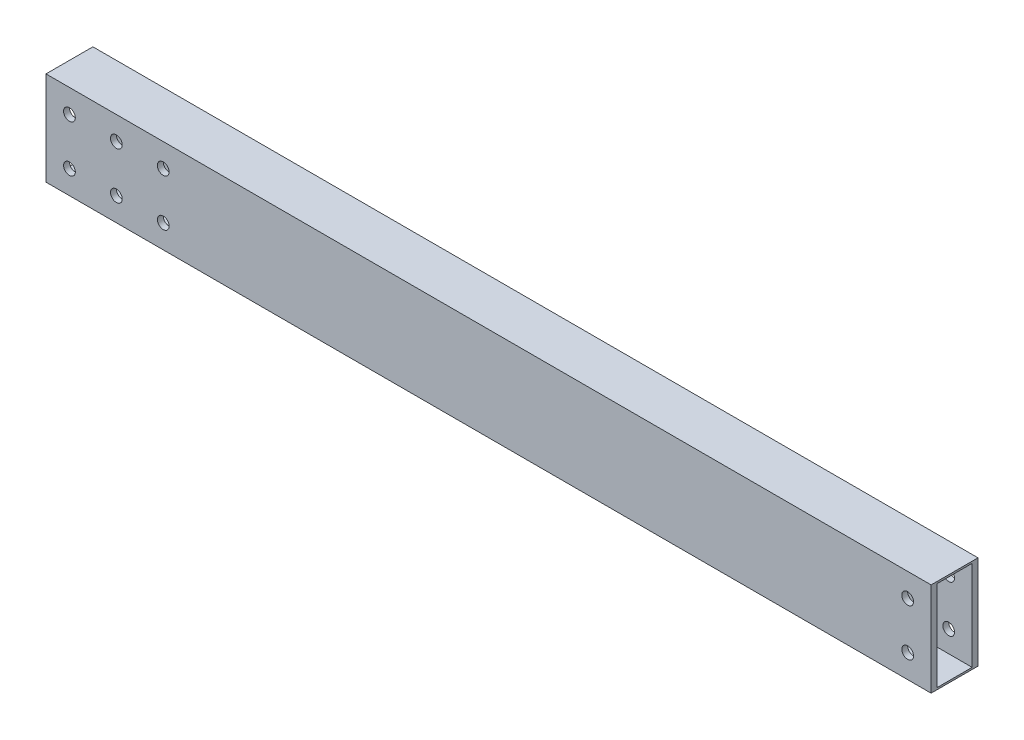
ISO-10303-21;
HEADER;
FILE_DESCRIPTION(('STEP AP214'),'2;1');
FILE_NAME('part.step','',(''),(''),'','','');
FILE_SCHEMA(('AUTOMOTIVE_DESIGN { 1 0 10303 214 1 1 1 1 }'));
ENDSEC;
DATA;
#1=APPLICATION_CONTEXT('core data for automotive mechanical design processes');
#2=APPLICATION_PROTOCOL_DEFINITION('international standard','automotive_design',2000,#1);
#3=PRODUCT_CONTEXT('',#1,'mechanical');
#4=PRODUCT('Part','Part','',(#3));
#5=PRODUCT_RELATED_PRODUCT_CATEGORY('part','',(#4));
#6=PRODUCT_DEFINITION_FORMATION('','',#4);
#7=PRODUCT_DEFINITION_CONTEXT('part definition',#1,'design');
#8=PRODUCT_DEFINITION('design','',#6,#7);
#9=PRODUCT_DEFINITION_SHAPE('','',#8);
#10=(LENGTH_UNIT() NAMED_UNIT(*) SI_UNIT(.MILLI.,.METRE.));
#11=(NAMED_UNIT(*) PLANE_ANGLE_UNIT() SI_UNIT($,.RADIAN.));
#12=(NAMED_UNIT(*) SI_UNIT($,.STERADIAN.) SOLID_ANGLE_UNIT());
#13=UNCERTAINTY_MEASURE_WITH_UNIT(LENGTH_MEASURE(1.E-05),#10,'distance_accuracy_value','');
#14=(GEOMETRIC_REPRESENTATION_CONTEXT(3) GLOBAL_UNCERTAINTY_ASSIGNED_CONTEXT((#13)) GLOBAL_UNIT_ASSIGNED_CONTEXT((#10,
#11,#12)) REPRESENTATION_CONTEXT('',''));
#15=CARTESIAN_POINT('',(0.,0.,0.));
#16=DIRECTION('',(0.,0.,1.));
#17=DIRECTION('',(1.,0.,0.));
#18=AXIS2_PLACEMENT_3D('',#15,#16,#17);
#19=CARTESIAN_POINT('',(479.336862,0.,0.));
#20=DIRECTION('',(0.,0.,-1.));
#21=DIRECTION('',(-1.,0.,0.));
#22=AXIS2_PLACEMENT_3D('',#19,#20,#21);
#23=PLANE('',#22);
#24=CARTESIAN_POINT('',(38.1,12.7,0.));
#25=DIRECTION('',(0.,0.,-1.));
#26=DIRECTION('',(-1.,0.,0.));
#27=AXIS2_PLACEMENT_3D('',#24,#25,#26);
#28=CIRCLE('',#27,3.175);
#29=CARTESIAN_POINT('',(34.925,12.7,0.));
#30=VERTEX_POINT('',#29);
#31=EDGE_CURVE('E146',#30,#30,#28,.T.);
#32=ORIENTED_EDGE('',*,*,#31,.T.);
#33=EDGE_LOOP('',(#32));
#34=FACE_BOUND('',#33,.T.);
#35=CARTESIAN_POINT('',(12.7,12.7,0.));
#36=DIRECTION('',(0.,0.,-1.));
#37=DIRECTION('',(-1.,0.,0.));
#38=AXIS2_PLACEMENT_3D('',#35,#36,#37);
#39=CIRCLE('',#38,3.175);
#40=CARTESIAN_POINT('',(9.525,12.7,0.));
#41=VERTEX_POINT('',#40);
#42=EDGE_CURVE('E251',#41,#41,#39,.T.);
#43=ORIENTED_EDGE('',*,*,#42,.T.);
#44=EDGE_LOOP('',(#43));
#45=FACE_BOUND('',#44,.T.);
#46=CARTESIAN_POINT('',(466.636862,12.7,0.));
#47=DIRECTION('',(0.,0.,-1.));
#48=DIRECTION('',(-1.,0.,0.));
#49=AXIS2_PLACEMENT_3D('',#46,#47,#48);
#50=CIRCLE('',#49,3.17499999999997);
#51=CARTESIAN_POINT('',(463.461862,12.7,0.));
#52=VERTEX_POINT('',#51);
#53=EDGE_CURVE('E245',#52,#52,#50,.T.);
#54=ORIENTED_EDGE('',*,*,#53,.T.);
#55=EDGE_LOOP('',(#54));
#56=FACE_BOUND('',#55,.T.);
#57=CARTESIAN_POINT('',(38.1,38.1,0.));
#58=DIRECTION('',(0.,0.,-1.));
#59=DIRECTION('',(-1.,0.,0.));
#60=AXIS2_PLACEMENT_3D('',#57,#58,#59);
#61=CIRCLE('',#60,3.175);
#62=CARTESIAN_POINT('',(34.925,38.1,0.));
#63=VERTEX_POINT('',#62);
#64=EDGE_CURVE('E240',#63,#63,#61,.T.);
#65=ORIENTED_EDGE('',*,*,#64,.T.);
#66=EDGE_LOOP('',(#65));
#67=FACE_BOUND('',#66,.T.);
#68=CARTESIAN_POINT('',(63.5,38.1,0.));
#69=DIRECTION('',(0.,0.,-1.));
#70=DIRECTION('',(-1.,0.,0.));
#71=AXIS2_PLACEMENT_3D('',#68,#69,#70);
#72=CIRCLE('',#71,3.175);
#73=CARTESIAN_POINT('',(60.325,38.1,0.));
#74=VERTEX_POINT('',#73);
#75=EDGE_CURVE('E235',#74,#74,#72,.T.);
#76=ORIENTED_EDGE('',*,*,#75,.T.);
#77=EDGE_LOOP('',(#76));
#78=FACE_BOUND('',#77,.T.);
#79=CARTESIAN_POINT('',(63.5,12.7,0.));
#80=DIRECTION('',(0.,0.,-1.));
#81=DIRECTION('',(-1.,0.,0.));
#82=AXIS2_PLACEMENT_3D('',#79,#80,#81);
#83=CIRCLE('',#82,3.175);
#84=CARTESIAN_POINT('',(60.325,12.7,0.));
#85=VERTEX_POINT('',#84);
#86=EDGE_CURVE('E229',#85,#85,#83,.T.);
#87=ORIENTED_EDGE('',*,*,#86,.T.);
#88=EDGE_LOOP('',(#87));
#89=FACE_BOUND('',#88,.T.);
#90=CARTESIAN_POINT('',(466.636862,38.1,0.));
#91=DIRECTION('',(0.,0.,-1.));
#92=DIRECTION('',(-1.,0.,0.));
#93=AXIS2_PLACEMENT_3D('',#90,#91,#92);
#94=CIRCLE('',#93,3.17499999999997);
#95=CARTESIAN_POINT('',(463.461862,38.1,0.));
#96=VERTEX_POINT('',#95);
#97=EDGE_CURVE('E223',#96,#96,#94,.T.);
#98=ORIENTED_EDGE('',*,*,#97,.T.);
#99=EDGE_LOOP('',(#98));
#100=FACE_BOUND('',#99,.T.);
#101=CARTESIAN_POINT('',(12.7,38.1,0.));
#102=DIRECTION('',(0.,0.,-1.));
#103=DIRECTION('',(-1.,0.,0.));
#104=AXIS2_PLACEMENT_3D('',#101,#102,#103);
#105=CIRCLE('',#104,3.175);
#106=CARTESIAN_POINT('',(9.525,38.1,0.));
#107=VERTEX_POINT('',#106);
#108=EDGE_CURVE('E217',#107,#107,#105,.T.);
#109=ORIENTED_EDGE('',*,*,#108,.T.);
#110=EDGE_LOOP('',(#109));
#111=FACE_BOUND('',#110,.T.);
#112=DIRECTION('',(0.,-1.,0.));
#113=VECTOR('',#112,1.);
#114=CARTESIAN_POINT('',(0.,0.,0.));
#115=LINE('',#114,#113);
#116=CARTESIAN_POINT('',(0.,50.8,0.));
#117=VERTEX_POINT('',#116);
#118=CARTESIAN_POINT('',(0.,0.,0.));
#119=VERTEX_POINT('',#118);
#120=EDGE_CURVE('E164',#117,#119,#115,.T.);
#121=ORIENTED_EDGE('',*,*,#120,.T.);
#122=DIRECTION('',(-1.,0.,0.));
#123=VECTOR('',#122,1.);
#124=CARTESIAN_POINT('',(479.336862,0.,0.));
#125=LINE('',#124,#123);
#126=CARTESIAN_POINT('',(479.336862,0.,0.));
#127=VERTEX_POINT('',#126);
#128=EDGE_CURVE('E11',#127,#119,#125,.T.);
#129=ORIENTED_EDGE('',*,*,#128,.F.);
#130=DIRECTION('',(0.,-1.,0.));
#131=VECTOR('',#130,1.);
#132=CARTESIAN_POINT('',(479.336862,0.,0.));
#133=LINE('',#132,#131);
#134=CARTESIAN_POINT('',(479.336862,50.8,0.));
#135=VERTEX_POINT('',#134);
#136=EDGE_CURVE('E170',#135,#127,#133,.T.);
#137=ORIENTED_EDGE('',*,*,#136,.F.);
#138=DIRECTION('',(-1.,0.,0.));
#139=VECTOR('',#138,1.);
#140=CARTESIAN_POINT('',(479.336862,50.8,0.));
#141=LINE('',#140,#139);
#142=EDGE_CURVE('E184',#135,#117,#141,.T.);
#143=ORIENTED_EDGE('',*,*,#142,.T.);
#144=EDGE_LOOP('',(#121,#129,#137,#143));
#145=FACE_BOUND('',#144,.T.);
#146=ADVANCED_FACE('F51',(#34,#45,#56,#67,#78,#89,#100,#111,#145),#23,.F.);
#147=CARTESIAN_POINT('',(479.336862,0.,0.));
#148=DIRECTION('',(0.,1.,0.));
#149=DIRECTION('',(0.,0.,1.));
#150=AXIS2_PLACEMENT_3D('',#147,#148,#149);
#151=PLANE('',#150);
#152=DIRECTION('',(0.,0.,-1.));
#153=VECTOR('',#152,1.);
#154=CARTESIAN_POINT('',(0.,0.,0.));
#155=LINE('',#154,#153);
#156=CARTESIAN_POINT('',(0.,0.,-25.4));
#157=VERTEX_POINT('',#156);
#158=EDGE_CURVE('E188',#119,#157,#155,.T.);
#159=ORIENTED_EDGE('',*,*,#158,.T.);
#160=DIRECTION('',(-1.,0.,0.));
#161=VECTOR('',#160,1.);
#162=CARTESIAN_POINT('',(479.336862,0.,-25.4));
#163=LINE('',#162,#161);
#164=CARTESIAN_POINT('',(479.336862,0.,-25.4));
#165=VERTEX_POINT('',#164);
#166=EDGE_CURVE('E60',#165,#157,#163,.T.);
#167=ORIENTED_EDGE('',*,*,#166,.F.);
#168=DIRECTION('',(0.,0.,-1.));
#169=VECTOR('',#168,1.);
#170=CARTESIAN_POINT('',(479.336862,0.,0.));
#171=LINE('',#170,#169);
#172=EDGE_CURVE('E174',#127,#165,#171,.T.);
#173=ORIENTED_EDGE('',*,*,#172,.F.);
#174=ORIENTED_EDGE('',*,*,#128,.T.);
#175=EDGE_LOOP('',(#159,#167,#173,#174));
#176=FACE_BOUND('',#175,.T.);
#177=ADVANCED_FACE('F301',(#176),#151,.F.);
#178=CARTESIAN_POINT('',(479.336862,0.,-25.4));
#179=DIRECTION('',(0.,0.,1.));
#180=DIRECTION('',(1.,0.,0.));
#181=AXIS2_PLACEMENT_3D('',#178,#179,#180);
#182=PLANE('',#181);
#183=CARTESIAN_POINT('',(38.1,12.7,-25.4));
#184=DIRECTION('',(0.,0.,1.));
#185=DIRECTION('',(1.,0.,0.));
#186=AXIS2_PLACEMENT_3D('',#183,#184,#185);
#187=CIRCLE('',#186,3.175);
#188=CARTESIAN_POINT('',(41.275,12.7,-25.4));
#189=VERTEX_POINT('',#188);
#190=EDGE_CURVE('E634',#189,#189,#187,.T.);
#191=ORIENTED_EDGE('',*,*,#190,.T.);
#192=EDGE_LOOP('',(#191));
#193=FACE_BOUND('',#192,.T.);
#194=CARTESIAN_POINT('',(12.7,12.7,-25.4));
#195=DIRECTION('',(0.,0.,1.));
#196=DIRECTION('',(1.,0.,0.));
#197=AXIS2_PLACEMENT_3D('',#194,#195,#196);
#198=CIRCLE('',#197,3.175);
#199=CARTESIAN_POINT('',(15.875,12.7,-25.4));
#200=VERTEX_POINT('',#199);
#201=EDGE_CURVE('E639',#200,#200,#198,.T.);
#202=ORIENTED_EDGE('',*,*,#201,.T.);
#203=EDGE_LOOP('',(#202));
#204=FACE_BOUND('',#203,.T.);
#205=CARTESIAN_POINT('',(466.636862,12.7,-25.4));
#206=DIRECTION('',(0.,0.,1.));
#207=DIRECTION('',(1.,0.,0.));
#208=AXIS2_PLACEMENT_3D('',#205,#206,#207);
#209=CIRCLE('',#208,3.17499999999997);
#210=CARTESIAN_POINT('',(469.811862,12.7,-25.4));
#211=VERTEX_POINT('',#210);
#212=EDGE_CURVE('E425',#211,#211,#209,.T.);
#213=ORIENTED_EDGE('',*,*,#212,.T.);
#214=EDGE_LOOP('',(#213));
#215=FACE_BOUND('',#214,.T.);
#216=CARTESIAN_POINT('',(38.1,38.1,-25.4));
#217=DIRECTION('',(0.,0.,1.));
#218=DIRECTION('',(1.,0.,0.));
#219=AXIS2_PLACEMENT_3D('',#216,#217,#218);
#220=CIRCLE('',#219,3.175);
#221=CARTESIAN_POINT('',(41.275,38.1,-25.4));
#222=VERTEX_POINT('',#221);
#223=EDGE_CURVE('E397',#222,#222,#220,.T.);
#224=ORIENTED_EDGE('',*,*,#223,.T.);
#225=EDGE_LOOP('',(#224));
#226=FACE_BOUND('',#225,.T.);
#227=CARTESIAN_POINT('',(63.5,38.1,-25.4));
#228=DIRECTION('',(0.,0.,1.));
#229=DIRECTION('',(1.,0.,0.));
#230=AXIS2_PLACEMENT_3D('',#227,#228,#229);
#231=CIRCLE('',#230,3.175);
#232=CARTESIAN_POINT('',(66.675,38.1,-25.4));
#233=VERTEX_POINT('',#232);
#234=EDGE_CURVE('E628',#233,#233,#231,.T.);
#235=ORIENTED_EDGE('',*,*,#234,.T.);
#236=EDGE_LOOP('',(#235));
#237=FACE_BOUND('',#236,.T.);
#238=CARTESIAN_POINT('',(63.5,12.7,-25.4));
#239=DIRECTION('',(0.,0.,1.));
#240=DIRECTION('',(1.,0.,0.));
#241=AXIS2_PLACEMENT_3D('',#238,#239,#240);
#242=CIRCLE('',#241,3.175);
#243=CARTESIAN_POINT('',(66.675,12.7,-25.4));
#244=VERTEX_POINT('',#243);
#245=EDGE_CURVE('E625',#244,#244,#242,.T.);
#246=ORIENTED_EDGE('',*,*,#245,.T.);
#247=EDGE_LOOP('',(#246));
#248=FACE_BOUND('',#247,.T.);
#249=CARTESIAN_POINT('',(466.636862,38.1,-25.4));
#250=DIRECTION('',(0.,0.,1.));
#251=DIRECTION('',(1.,0.,0.));
#252=AXIS2_PLACEMENT_3D('',#249,#250,#251);
#253=CIRCLE('',#252,3.17499999999997);
#254=CARTESIAN_POINT('',(469.811862,38.1,-25.4));
#255=VERTEX_POINT('',#254);
#256=EDGE_CURVE('E629',#255,#255,#253,.T.);
#257=ORIENTED_EDGE('',*,*,#256,.T.);
#258=EDGE_LOOP('',(#257));
#259=FACE_BOUND('',#258,.T.);
#260=CARTESIAN_POINT('',(12.7,38.1,-25.4));
#261=DIRECTION('',(0.,0.,1.));
#262=DIRECTION('',(1.,0.,0.));
#263=AXIS2_PLACEMENT_3D('',#260,#261,#262);
#264=CIRCLE('',#263,3.175);
#265=CARTESIAN_POINT('',(15.875,38.1,-25.4));
#266=VERTEX_POINT('',#265);
#267=EDGE_CURVE('E211',#266,#266,#264,.T.);
#268=ORIENTED_EDGE('',*,*,#267,.T.);
#269=EDGE_LOOP('',(#268));
#270=FACE_BOUND('',#269,.T.);
#271=DIRECTION('',(0.,1.,0.));
#272=VECTOR('',#271,1.);
#273=CARTESIAN_POINT('',(0.,0.,-25.4));
#274=LINE('',#273,#272);
#275=CARTESIAN_POINT('',(0.,50.8,-25.4));
#276=VERTEX_POINT('',#275);
#277=EDGE_CURVE('E191',#157,#276,#274,.T.);
#278=ORIENTED_EDGE('',*,*,#277,.T.);
#279=DIRECTION('',(-1.,0.,0.));
#280=VECTOR('',#279,1.);
#281=CARTESIAN_POINT('',(479.336862,50.8,-25.4));
#282=LINE('',#281,#280);
#283=CARTESIAN_POINT('',(479.336862,50.8,-25.4));
#284=VERTEX_POINT('',#283);
#285=EDGE_CURVE('E199',#284,#276,#282,.T.);
#286=ORIENTED_EDGE('',*,*,#285,.F.);
#287=DIRECTION('',(0.,1.,0.));
#288=VECTOR('',#287,1.);
#289=CARTESIAN_POINT('',(479.336862,0.,-25.4));
#290=LINE('',#289,#288);
#291=EDGE_CURVE('E178',#165,#284,#290,.T.);
#292=ORIENTED_EDGE('',*,*,#291,.F.);
#293=ORIENTED_EDGE('',*,*,#166,.T.);
#294=EDGE_LOOP('',(#278,#286,#292,#293));
#295=FACE_BOUND('',#294,.T.);
#296=ADVANCED_FACE('F306',(#193,#204,#215,#226,#237,#248,#259,#270,#295),#182,.F.);
#297=CARTESIAN_POINT('',(479.336862,50.8,0.));
#298=DIRECTION('',(0.,-1.,0.));
#299=DIRECTION('',(0.,0.,-1.));
#300=AXIS2_PLACEMENT_3D('',#297,#298,#299);
#301=PLANE('',#300);
#302=DIRECTION('',(0.,0.,1.));
#303=VECTOR('',#302,1.);
#304=CARTESIAN_POINT('',(0.,50.8,0.));
#305=LINE('',#304,#303);
#306=EDGE_CURVE('E175',#276,#117,#305,.T.);
#307=ORIENTED_EDGE('',*,*,#306,.T.);
#308=ORIENTED_EDGE('',*,*,#142,.F.);
#309=DIRECTION('',(0.,0.,1.));
#310=VECTOR('',#309,1.);
#311=CARTESIAN_POINT('',(479.336862,50.8,0.));
#312=LINE('',#311,#310);
#313=EDGE_CURVE('E181',#284,#135,#312,.T.);
#314=ORIENTED_EDGE('',*,*,#313,.F.);
#315=ORIENTED_EDGE('',*,*,#285,.T.);
#316=EDGE_LOOP('',(#307,#308,#314,#315));
#317=FACE_BOUND('',#316,.T.);
#318=ADVANCED_FACE('F340',(#317),#301,.F.);
#319=CARTESIAN_POINT('',(479.336862,0.,0.));
#320=DIRECTION('',(-1.,0.,0.));
#321=DIRECTION('',(0.,0.,1.));
#322=AXIS2_PLACEMENT_3D('',#319,#320,#321);
#323=PLANE('',#322);
#324=DIRECTION('',(0.,0.,-1.));
#325=VECTOR('',#324,1.);
#326=CARTESIAN_POINT('',(479.336862,1.016,-3.17500000000001));
#327=LINE('',#326,#325);
#328=CARTESIAN_POINT('',(479.336862,1.016,-3.17500000000001));
#329=VERTEX_POINT('',#328);
#330=CARTESIAN_POINT('',(479.336862,1.016,-22.225));
#331=VERTEX_POINT('',#330);
#332=EDGE_CURVE('E155',#329,#331,#327,.T.);
#333=ORIENTED_EDGE('',*,*,#332,.F.);
#334=DIRECTION('',(0.,-1.,0.));
#335=VECTOR('',#334,1.);
#336=CARTESIAN_POINT('',(479.336862,49.784,-3.175));
#337=LINE('',#336,#335);
#338=CARTESIAN_POINT('',(479.336862,49.784,-3.175));
#339=VERTEX_POINT('',#338);
#340=EDGE_CURVE('E68',#339,#329,#337,.T.);
#341=ORIENTED_EDGE('',*,*,#340,.F.);
#342=DIRECTION('',(0.,0.,1.));
#343=VECTOR('',#342,1.);
#344=CARTESIAN_POINT('',(479.336862,49.784,-3.175));
#345=LINE('',#344,#343);
#346=CARTESIAN_POINT('',(479.336862,49.784,-22.225));
#347=VERTEX_POINT('',#346);
#348=EDGE_CURVE('E139',#347,#339,#345,.T.);
#349=ORIENTED_EDGE('',*,*,#348,.F.);
#350=DIRECTION('',(0.,1.,0.));
#351=VECTOR('',#350,1.);
#352=CARTESIAN_POINT('',(479.336862,49.784,-22.225));
#353=LINE('',#352,#351);
#354=EDGE_CURVE('E143',#331,#347,#353,.T.);
#355=ORIENTED_EDGE('',*,*,#354,.F.);
#356=EDGE_LOOP('',(#333,#341,#349,#355));
#357=FACE_BOUND('',#356,.T.);
#358=ORIENTED_EDGE('',*,*,#136,.T.);
#359=ORIENTED_EDGE('',*,*,#172,.T.);
#360=ORIENTED_EDGE('',*,*,#291,.T.);
#361=ORIENTED_EDGE('',*,*,#313,.T.);
#362=EDGE_LOOP('',(#358,#359,#360,#361));
#363=FACE_BOUND('',#362,.T.);
#364=ADVANCED_FACE('F336',(#357,#363),#323,.F.);
#365=CARTESIAN_POINT('',(0.,0.,0.));
#366=DIRECTION('',(-1.,0.,0.));
#367=DIRECTION('',(0.,0.,1.));
#368=AXIS2_PLACEMENT_3D('',#365,#366,#367);
#369=PLANE('',#368);
#370=DIRECTION('',(0.,-1.,0.));
#371=VECTOR('',#370,1.);
#372=CARTESIAN_POINT('',(0.,49.784,-3.175));
#373=LINE('',#372,#371);
#374=CARTESIAN_POINT('',(0.,49.784,-3.175));
#375=VERTEX_POINT('',#374);
#376=CARTESIAN_POINT('',(0.,1.016,-3.17500000000001));
#377=VERTEX_POINT('',#376);
#378=EDGE_CURVE('E120',#375,#377,#373,.T.);
#379=ORIENTED_EDGE('',*,*,#378,.T.);
#380=DIRECTION('',(0.,0.,-1.));
#381=VECTOR('',#380,1.);
#382=CARTESIAN_POINT('',(0.,1.016,-3.17500000000001));
#383=LINE('',#382,#381);
#384=CARTESIAN_POINT('',(0.,1.016,-22.225));
#385=VERTEX_POINT('',#384);
#386=EDGE_CURVE('E130',#377,#385,#383,.T.);
#387=ORIENTED_EDGE('',*,*,#386,.T.);
#388=DIRECTION('',(0.,1.,0.));
#389=VECTOR('',#388,1.);
#390=CARTESIAN_POINT('',(0.,49.784,-22.225));
#391=LINE('',#390,#389);
#392=CARTESIAN_POINT('',(0.,49.784,-22.225));
#393=VERTEX_POINT('',#392);
#394=EDGE_CURVE('E76',#385,#393,#391,.T.);
#395=ORIENTED_EDGE('',*,*,#394,.T.);
#396=DIRECTION('',(0.,0.,1.));
#397=VECTOR('',#396,1.);
#398=CARTESIAN_POINT('',(0.,49.784,-3.175));
#399=LINE('',#398,#397);
#400=EDGE_CURVE('E127',#393,#375,#399,.T.);
#401=ORIENTED_EDGE('',*,*,#400,.T.);
#402=EDGE_LOOP('',(#379,#387,#395,#401));
#403=FACE_BOUND('',#402,.T.);
#404=ORIENTED_EDGE('',*,*,#120,.F.);
#405=ORIENTED_EDGE('',*,*,#306,.F.);
#406=ORIENTED_EDGE('',*,*,#277,.F.);
#407=ORIENTED_EDGE('',*,*,#158,.F.);
#408=EDGE_LOOP('',(#404,#405,#406,#407));
#409=FACE_BOUND('',#408,.T.);
#410=ADVANCED_FACE('F135',(#403,#409),#369,.T.);
#411=CARTESIAN_POINT('',(0.,49.784,-3.175));
#412=DIRECTION('',(0.,0.,1.));
#413=DIRECTION('',(0.,-1.,0.));
#414=AXIS2_PLACEMENT_3D('',#411,#412,#413);
#415=PLANE('',#414);
#416=CARTESIAN_POINT('',(38.1,12.7,-3.175));
#417=DIRECTION('',(0.,0.,1.));
#418=DIRECTION('',(0.,-1.,0.));
#419=AXIS2_PLACEMENT_3D('',#416,#417,#418);
#420=CIRCLE('',#419,3.175);
#421=CARTESIAN_POINT('',(38.1,9.525,-3.175));
#422=VERTEX_POINT('',#421);
#423=EDGE_CURVE('E264',#422,#422,#420,.T.);
#424=ORIENTED_EDGE('',*,*,#423,.T.);
#425=EDGE_LOOP('',(#424));
#426=FACE_BOUND('',#425,.T.);
#427=CARTESIAN_POINT('',(12.7,12.7,-3.175));
#428=DIRECTION('',(0.,0.,1.));
#429=DIRECTION('',(0.,-1.,0.));
#430=AXIS2_PLACEMENT_3D('',#427,#428,#429);
#431=CIRCLE('',#430,3.175);
#432=CARTESIAN_POINT('',(12.7,9.525,-3.175));
#433=VERTEX_POINT('',#432);
#434=EDGE_CURVE('E244',#433,#433,#431,.T.);
#435=ORIENTED_EDGE('',*,*,#434,.T.);
#436=EDGE_LOOP('',(#435));
#437=FACE_BOUND('',#436,.T.);
#438=CARTESIAN_POINT('',(466.636862,12.7,-3.175));
#439=DIRECTION('',(0.,0.,1.));
#440=DIRECTION('',(0.,-1.,0.));
#441=AXIS2_PLACEMENT_3D('',#438,#439,#440);
#442=CIRCLE('',#441,3.17499999999997);
#443=CARTESIAN_POINT('',(466.636862,9.52500000000003,-3.175));
#444=VERTEX_POINT('',#443);
#445=EDGE_CURVE('E239',#444,#444,#442,.T.);
#446=ORIENTED_EDGE('',*,*,#445,.T.);
#447=EDGE_LOOP('',(#446));
#448=FACE_BOUND('',#447,.T.);
#449=CARTESIAN_POINT('',(38.1,38.1,-3.175));
#450=DIRECTION('',(0.,0.,1.));
#451=DIRECTION('',(0.,-1.,0.));
#452=AXIS2_PLACEMENT_3D('',#449,#450,#451);
#453=CIRCLE('',#452,3.175);
#454=CARTESIAN_POINT('',(38.1,34.925,-3.175));
#455=VERTEX_POINT('',#454);
#456=EDGE_CURVE('E234',#455,#455,#453,.T.);
#457=ORIENTED_EDGE('',*,*,#456,.T.);
#458=EDGE_LOOP('',(#457));
#459=FACE_BOUND('',#458,.T.);
#460=CARTESIAN_POINT('',(63.5,38.1,-3.175));
#461=DIRECTION('',(0.,0.,1.));
#462=DIRECTION('',(0.,-1.,0.));
#463=AXIS2_PLACEMENT_3D('',#460,#461,#462);
#464=CIRCLE('',#463,3.175);
#465=CARTESIAN_POINT('',(63.5,34.925,-3.175));
#466=VERTEX_POINT('',#465);
#467=EDGE_CURVE('E228',#466,#466,#464,.T.);
#468=ORIENTED_EDGE('',*,*,#467,.T.);
#469=EDGE_LOOP('',(#468));
#470=FACE_BOUND('',#469,.T.);
#471=CARTESIAN_POINT('',(63.5,12.7,-3.175));
#472=DIRECTION('',(0.,0.,1.));
#473=DIRECTION('',(0.,-1.,0.));
#474=AXIS2_PLACEMENT_3D('',#471,#472,#473);
#475=CIRCLE('',#474,3.175);
#476=CARTESIAN_POINT('',(63.5,9.525,-3.175));
#477=VERTEX_POINT('',#476);
#478=EDGE_CURVE('E222',#477,#477,#475,.T.);
#479=ORIENTED_EDGE('',*,*,#478,.T.);
#480=EDGE_LOOP('',(#479));
#481=FACE_BOUND('',#480,.T.);
#482=CARTESIAN_POINT('',(466.636862,38.1,-3.175));
#483=DIRECTION('',(0.,0.,1.));
#484=DIRECTION('',(0.,-1.,0.));
#485=AXIS2_PLACEMENT_3D('',#482,#483,#484);
#486=CIRCLE('',#485,3.17499999999997);
#487=CARTESIAN_POINT('',(466.636862,34.925,-3.175));
#488=VERTEX_POINT('',#487);
#489=EDGE_CURVE('E216',#488,#488,#486,.T.);
#490=ORIENTED_EDGE('',*,*,#489,.T.);
#491=EDGE_LOOP('',(#490));
#492=FACE_BOUND('',#491,.T.);
#493=CARTESIAN_POINT('',(12.7,38.1,-3.175));
#494=DIRECTION('',(0.,0.,1.));
#495=DIRECTION('',(0.,-1.,0.));
#496=AXIS2_PLACEMENT_3D('',#493,#494,#495);
#497=CIRCLE('',#496,3.175);
#498=CARTESIAN_POINT('',(12.7,34.925,-3.175));
#499=VERTEX_POINT('',#498);
#500=EDGE_CURVE('E210',#499,#499,#497,.T.);
#501=ORIENTED_EDGE('',*,*,#500,.T.);
#502=EDGE_LOOP('',(#501));
#503=FACE_BOUND('',#502,.T.);
#504=ORIENTED_EDGE('',*,*,#340,.T.);
#505=DIRECTION('',(1.,0.,0.));
#506=VECTOR('',#505,1.);
#507=CARTESIAN_POINT('',(0.,1.016,-3.17500000000001));
#508=LINE('',#507,#506);
#509=EDGE_CURVE('E116',#377,#329,#508,.T.);
#510=ORIENTED_EDGE('',*,*,#509,.F.);
#511=ORIENTED_EDGE('',*,*,#378,.F.);
#512=DIRECTION('',(1.,0.,0.));
#513=VECTOR('',#512,1.);
#514=CARTESIAN_POINT('',(0.,49.784,-3.175));
#515=LINE('',#514,#513);
#516=EDGE_CURVE('E161',#375,#339,#515,.T.);
#517=ORIENTED_EDGE('',*,*,#516,.T.);
#518=EDGE_LOOP('',(#504,#510,#511,#517));
#519=FACE_BOUND('',#518,.T.);
#520=ADVANCED_FACE('F118',(#426,#437,#448,#459,#470,#481,#492,#503,#519),#415,.F.);
#521=CARTESIAN_POINT('',(0.,49.784,-3.175));
#522=DIRECTION('',(0.,1.,0.));
#523=DIRECTION('',(0.,0.,1.));
#524=AXIS2_PLACEMENT_3D('',#521,#522,#523);
#525=PLANE('',#524);
#526=ORIENTED_EDGE('',*,*,#348,.T.);
#527=ORIENTED_EDGE('',*,*,#516,.F.);
#528=ORIENTED_EDGE('',*,*,#400,.F.);
#529=DIRECTION('',(1.,0.,0.));
#530=VECTOR('',#529,1.);
#531=CARTESIAN_POINT('',(0.,49.784,-22.225));
#532=LINE('',#531,#530);
#533=EDGE_CURVE('E165',#393,#347,#532,.T.);
#534=ORIENTED_EDGE('',*,*,#533,.T.);
#535=EDGE_LOOP('',(#526,#527,#528,#534));
#536=FACE_BOUND('',#535,.T.);
#537=ADVANCED_FACE('F360',(#536),#525,.F.);
#538=CARTESIAN_POINT('',(0.,49.784,-22.225));
#539=DIRECTION('',(0.,0.,-1.));
#540=DIRECTION('',(0.,1.,0.));
#541=AXIS2_PLACEMENT_3D('',#538,#539,#540);
#542=PLANE('',#541);
#543=CARTESIAN_POINT('',(38.1,12.7,-22.225));
#544=DIRECTION('',(0.,0.,-1.));
#545=DIRECTION('',(0.,1.,0.));
#546=AXIS2_PLACEMENT_3D('',#543,#544,#545);
#547=CIRCLE('',#546,3.175);
#548=CARTESIAN_POINT('',(38.1,15.875,-22.225));
#549=VERTEX_POINT('',#548);
#550=EDGE_CURVE('E54',#549,#549,#547,.T.);
#551=ORIENTED_EDGE('',*,*,#550,.T.);
#552=EDGE_LOOP('',(#551));
#553=FACE_BOUND('',#552,.T.);
#554=CARTESIAN_POINT('',(12.7,12.7,-22.225));
#555=DIRECTION('',(0.,0.,-1.));
#556=DIRECTION('',(0.,1.,0.));
#557=AXIS2_PLACEMENT_3D('',#554,#555,#556);
#558=CIRCLE('',#557,3.175);
#559=CARTESIAN_POINT('',(12.7,15.875,-22.225));
#560=VERTEX_POINT('',#559);
#561=EDGE_CURVE('E241',#560,#560,#558,.T.);
#562=ORIENTED_EDGE('',*,*,#561,.T.);
#563=EDGE_LOOP('',(#562));
#564=FACE_BOUND('',#563,.T.);
#565=CARTESIAN_POINT('',(466.636862,12.7,-22.225));
#566=DIRECTION('',(0.,0.,-1.));
#567=DIRECTION('',(0.,1.,0.));
#568=AXIS2_PLACEMENT_3D('',#565,#566,#567);
#569=CIRCLE('',#568,3.17499999999997);
#570=CARTESIAN_POINT('',(466.636862,15.875,-22.225));
#571=VERTEX_POINT('',#570);
#572=EDGE_CURVE('E236',#571,#571,#569,.T.);
#573=ORIENTED_EDGE('',*,*,#572,.T.);
#574=EDGE_LOOP('',(#573));
#575=FACE_BOUND('',#574,.T.);
#576=CARTESIAN_POINT('',(38.1,38.1,-22.225));
#577=DIRECTION('',(0.,0.,-1.));
#578=DIRECTION('',(0.,1.,0.));
#579=AXIS2_PLACEMENT_3D('',#576,#577,#578);
#580=CIRCLE('',#579,3.175);
#581=CARTESIAN_POINT('',(38.1,41.275,-22.225));
#582=VERTEX_POINT('',#581);
#583=EDGE_CURVE('E230',#582,#582,#580,.T.);
#584=ORIENTED_EDGE('',*,*,#583,.T.);
#585=EDGE_LOOP('',(#584));
#586=FACE_BOUND('',#585,.T.);
#587=CARTESIAN_POINT('',(63.5,38.1,-22.225));
#588=DIRECTION('',(0.,0.,-1.));
#589=DIRECTION('',(0.,1.,0.));
#590=AXIS2_PLACEMENT_3D('',#587,#588,#589);
#591=CIRCLE('',#590,3.175);
#592=CARTESIAN_POINT('',(63.5,41.275,-22.225));
#593=VERTEX_POINT('',#592);
#594=EDGE_CURVE('E224',#593,#593,#591,.T.);
#595=ORIENTED_EDGE('',*,*,#594,.T.);
#596=EDGE_LOOP('',(#595));
#597=FACE_BOUND('',#596,.T.);
#598=CARTESIAN_POINT('',(63.5,12.7,-22.225));
#599=DIRECTION('',(0.,0.,-1.));
#600=DIRECTION('',(0.,1.,0.));
#601=AXIS2_PLACEMENT_3D('',#598,#599,#600);
#602=CIRCLE('',#601,3.175);
#603=CARTESIAN_POINT('',(63.5,15.875,-22.225));
#604=VERTEX_POINT('',#603);
#605=EDGE_CURVE('E218',#604,#604,#602,.T.);
#606=ORIENTED_EDGE('',*,*,#605,.T.);
#607=EDGE_LOOP('',(#606));
#608=FACE_BOUND('',#607,.T.);
#609=CARTESIAN_POINT('',(466.636862,38.1,-22.225));
#610=DIRECTION('',(0.,0.,-1.));
#611=DIRECTION('',(0.,1.,0.));
#612=AXIS2_PLACEMENT_3D('',#609,#610,#611);
#613=CIRCLE('',#612,3.17499999999997);
#614=CARTESIAN_POINT('',(466.636862,41.275,-22.225));
#615=VERTEX_POINT('',#614);
#616=EDGE_CURVE('E212',#615,#615,#613,.T.);
#617=ORIENTED_EDGE('',*,*,#616,.T.);
#618=EDGE_LOOP('',(#617));
#619=FACE_BOUND('',#618,.T.);
#620=CARTESIAN_POINT('',(12.7,38.1,-22.225));
#621=DIRECTION('',(0.,0.,-1.));
#622=DIRECTION('',(0.,1.,0.));
#623=AXIS2_PLACEMENT_3D('',#620,#621,#622);
#624=CIRCLE('',#623,3.175);
#625=CARTESIAN_POINT('',(12.7,41.275,-22.225));
#626=VERTEX_POINT('',#625);
#627=EDGE_CURVE('E206',#626,#626,#624,.T.);
#628=ORIENTED_EDGE('',*,*,#627,.T.);
#629=EDGE_LOOP('',(#628));
#630=FACE_BOUND('',#629,.T.);
#631=ORIENTED_EDGE('',*,*,#354,.T.);
#632=ORIENTED_EDGE('',*,*,#533,.F.);
#633=ORIENTED_EDGE('',*,*,#394,.F.);
#634=DIRECTION('',(1.,0.,0.));
#635=VECTOR('',#634,1.);
#636=CARTESIAN_POINT('',(0.,1.016,-22.225));
#637=LINE('',#636,#635);
#638=EDGE_CURVE('E126',#385,#331,#637,.T.);
#639=ORIENTED_EDGE('',*,*,#638,.T.);
#640=EDGE_LOOP('',(#631,#632,#633,#639));
#641=FACE_BOUND('',#640,.T.);
#642=ADVANCED_FACE('F275',(#553,#564,#575,#586,#597,#608,#619,#630,#641),#542,.F.);
#643=CARTESIAN_POINT('',(0.,1.016,-3.17500000000001));
#644=DIRECTION('',(0.,-1.,0.));
#645=DIRECTION('',(0.,0.,-1.));
#646=AXIS2_PLACEMENT_3D('',#643,#644,#645);
#647=PLANE('',#646);
#648=ORIENTED_EDGE('',*,*,#332,.T.);
#649=ORIENTED_EDGE('',*,*,#638,.F.);
#650=ORIENTED_EDGE('',*,*,#386,.F.);
#651=ORIENTED_EDGE('',*,*,#509,.T.);
#652=EDGE_LOOP('',(#648,#649,#650,#651));
#653=FACE_BOUND('',#652,.T.);
#654=ADVANCED_FACE('F131',(#653),#647,.F.);
#655=CARTESIAN_POINT('',(12.7,38.1,-25.4));
#656=DIRECTION('',(0.,0.,1.));
#657=DIRECTION('',(1.,0.,0.));
#658=AXIS2_PLACEMENT_3D('',#655,#656,#657);
#659=CYLINDRICAL_SURFACE('',#658,3.175);
#660=ORIENTED_EDGE('',*,*,#267,.F.);
#661=EDGE_LOOP('',(#660));
#662=FACE_BOUND('',#661,.T.);
#663=ORIENTED_EDGE('',*,*,#627,.F.);
#664=EDGE_LOOP('',(#663));
#665=FACE_BOUND('',#664,.T.);
#666=ADVANCED_FACE('F291',(#662,#665),#659,.F.);
#667=CARTESIAN_POINT('',(466.636862,38.1,-25.4));
#668=DIRECTION('',(0.,0.,1.));
#669=DIRECTION('',(1.,0.,0.));
#670=AXIS2_PLACEMENT_3D('',#667,#668,#669);
#671=CYLINDRICAL_SURFACE('',#670,3.17499999999997);
#672=ORIENTED_EDGE('',*,*,#256,.F.);
#673=EDGE_LOOP('',(#672));
#674=FACE_BOUND('',#673,.T.);
#675=ORIENTED_EDGE('',*,*,#616,.F.);
#676=EDGE_LOOP('',(#675));
#677=FACE_BOUND('',#676,.T.);
#678=ADVANCED_FACE('F412',(#674,#677),#671,.F.);
#679=CARTESIAN_POINT('',(63.5,12.7,-25.4));
#680=DIRECTION('',(0.,0.,1.));
#681=DIRECTION('',(1.,0.,0.));
#682=AXIS2_PLACEMENT_3D('',#679,#680,#681);
#683=CYLINDRICAL_SURFACE('',#682,3.175);
#684=ORIENTED_EDGE('',*,*,#245,.F.);
#685=EDGE_LOOP('',(#684));
#686=FACE_BOUND('',#685,.T.);
#687=ORIENTED_EDGE('',*,*,#605,.F.);
#688=EDGE_LOOP('',(#687));
#689=FACE_BOUND('',#688,.T.);
#690=ADVANCED_FACE('F392',(#686,#689),#683,.F.);
#691=CARTESIAN_POINT('',(63.5,38.1,-25.4));
#692=DIRECTION('',(0.,0.,1.));
#693=DIRECTION('',(1.,0.,0.));
#694=AXIS2_PLACEMENT_3D('',#691,#692,#693);
#695=CYLINDRICAL_SURFACE('',#694,3.175);
#696=ORIENTED_EDGE('',*,*,#234,.F.);
#697=EDGE_LOOP('',(#696));
#698=FACE_BOUND('',#697,.T.);
#699=ORIENTED_EDGE('',*,*,#594,.F.);
#700=EDGE_LOOP('',(#699));
#701=FACE_BOUND('',#700,.T.);
#702=ADVANCED_FACE('F382',(#698,#701),#695,.F.);
#703=CARTESIAN_POINT('',(38.1,38.1,-25.4));
#704=DIRECTION('',(0.,0.,1.));
#705=DIRECTION('',(1.,0.,0.));
#706=AXIS2_PLACEMENT_3D('',#703,#704,#705);
#707=CYLINDRICAL_SURFACE('',#706,3.175);
#708=ORIENTED_EDGE('',*,*,#223,.F.);
#709=EDGE_LOOP('',(#708));
#710=FACE_BOUND('',#709,.T.);
#711=ORIENTED_EDGE('',*,*,#583,.F.);
#712=EDGE_LOOP('',(#711));
#713=FACE_BOUND('',#712,.T.);
#714=ADVANCED_FACE('F375',(#710,#713),#707,.F.);
#715=CARTESIAN_POINT('',(466.636862,12.7,-25.4));
#716=DIRECTION('',(0.,0.,1.));
#717=DIRECTION('',(1.,0.,0.));
#718=AXIS2_PLACEMENT_3D('',#715,#716,#717);
#719=CYLINDRICAL_SURFACE('',#718,3.17499999999997);
#720=ORIENTED_EDGE('',*,*,#212,.F.);
#721=EDGE_LOOP('',(#720));
#722=FACE_BOUND('',#721,.T.);
#723=ORIENTED_EDGE('',*,*,#572,.F.);
#724=EDGE_LOOP('',(#723));
#725=FACE_BOUND('',#724,.T.);
#726=ADVANCED_FACE('F292',(#722,#725),#719,.F.);
#727=CARTESIAN_POINT('',(12.7,12.7,-25.4));
#728=DIRECTION('',(0.,0.,1.));
#729=DIRECTION('',(1.,0.,0.));
#730=AXIS2_PLACEMENT_3D('',#727,#728,#729);
#731=CYLINDRICAL_SURFACE('',#730,3.175);
#732=ORIENTED_EDGE('',*,*,#201,.F.);
#733=EDGE_LOOP('',(#732));
#734=FACE_BOUND('',#733,.T.);
#735=ORIENTED_EDGE('',*,*,#561,.F.);
#736=EDGE_LOOP('',(#735));
#737=FACE_BOUND('',#736,.T.);
#738=ADVANCED_FACE('F280',(#734,#737),#731,.F.);
#739=CARTESIAN_POINT('',(38.1,12.7,-25.4));
#740=DIRECTION('',(0.,0.,1.));
#741=DIRECTION('',(1.,0.,0.));
#742=AXIS2_PLACEMENT_3D('',#739,#740,#741);
#743=CYLINDRICAL_SURFACE('',#742,3.175);
#744=ORIENTED_EDGE('',*,*,#190,.F.);
#745=EDGE_LOOP('',(#744));
#746=FACE_BOUND('',#745,.T.);
#747=ORIENTED_EDGE('',*,*,#550,.F.);
#748=EDGE_LOOP('',(#747));
#749=FACE_BOUND('',#748,.T.);
#750=ADVANCED_FACE('F277',(#746,#749),#743,.F.);
#751=ORIENTED_EDGE('',*,*,#500,.F.);
#752=EDGE_LOOP('',(#751));
#753=FACE_BOUND('',#752,.T.);
#754=ORIENTED_EDGE('',*,*,#108,.F.);
#755=EDGE_LOOP('',(#754));
#756=FACE_BOUND('',#755,.T.);
#757=ADVANCED_FACE('F279',(#753,#756),#659,.F.);
#758=ORIENTED_EDGE('',*,*,#489,.F.);
#759=EDGE_LOOP('',(#758));
#760=FACE_BOUND('',#759,.T.);
#761=ORIENTED_EDGE('',*,*,#97,.F.);
#762=EDGE_LOOP('',(#761));
#763=FACE_BOUND('',#762,.T.);
#764=ADVANCED_FACE('F288',(#760,#763),#671,.F.);
#765=ORIENTED_EDGE('',*,*,#478,.F.);
#766=EDGE_LOOP('',(#765));
#767=FACE_BOUND('',#766,.T.);
#768=ORIENTED_EDGE('',*,*,#86,.F.);
#769=EDGE_LOOP('',(#768));
#770=FACE_BOUND('',#769,.T.);
#771=ADVANCED_FACE('F379',(#767,#770),#683,.F.);
#772=ORIENTED_EDGE('',*,*,#467,.F.);
#773=EDGE_LOOP('',(#772));
#774=FACE_BOUND('',#773,.T.);
#775=ORIENTED_EDGE('',*,*,#75,.F.);
#776=EDGE_LOOP('',(#775));
#777=FACE_BOUND('',#776,.T.);
#778=ADVANCED_FACE('F373',(#774,#777),#695,.F.);
#779=ORIENTED_EDGE('',*,*,#456,.F.);
#780=EDGE_LOOP('',(#779));
#781=FACE_BOUND('',#780,.T.);
#782=ORIENTED_EDGE('',*,*,#64,.F.);
#783=EDGE_LOOP('',(#782));
#784=FACE_BOUND('',#783,.T.);
#785=ADVANCED_FACE('F370',(#781,#784),#707,.F.);
#786=ORIENTED_EDGE('',*,*,#445,.F.);
#787=EDGE_LOOP('',(#786));
#788=FACE_BOUND('',#787,.T.);
#789=ORIENTED_EDGE('',*,*,#53,.F.);
#790=EDGE_LOOP('',(#789));
#791=FACE_BOUND('',#790,.T.);
#792=ADVANCED_FACE('F368',(#788,#791),#719,.F.);
#793=ORIENTED_EDGE('',*,*,#434,.F.);
#794=EDGE_LOOP('',(#793));
#795=FACE_BOUND('',#794,.T.);
#796=ORIENTED_EDGE('',*,*,#42,.F.);
#797=EDGE_LOOP('',(#796));
#798=FACE_BOUND('',#797,.T.);
#799=ADVANCED_FACE('F295',(#795,#798),#731,.F.);
#800=ORIENTED_EDGE('',*,*,#423,.F.);
#801=EDGE_LOOP('',(#800));
#802=FACE_BOUND('',#801,.T.);
#803=ORIENTED_EDGE('',*,*,#31,.F.);
#804=EDGE_LOOP('',(#803));
#805=FACE_BOUND('',#804,.T.);
#806=ADVANCED_FACE('F283',(#802,#805),#743,.F.);
#807=CLOSED_SHELL('',(#146,#177,#296,#318,#364,#410,#520,#537,#642,#654,#666,#678,#690,#702,
#714,#726,#738,#750,#757,#764,#771,#778,#785,#792,#799,#806));
#808=MANIFOLD_SOLID_BREP('B2',#807);
#809=ADVANCED_BREP_SHAPE_REPRESENTATION('',(#18,#808),#14);
#810=SHAPE_DEFINITION_REPRESENTATION(#9,#809);
ENDSEC;
END-ISO-10303-21;
